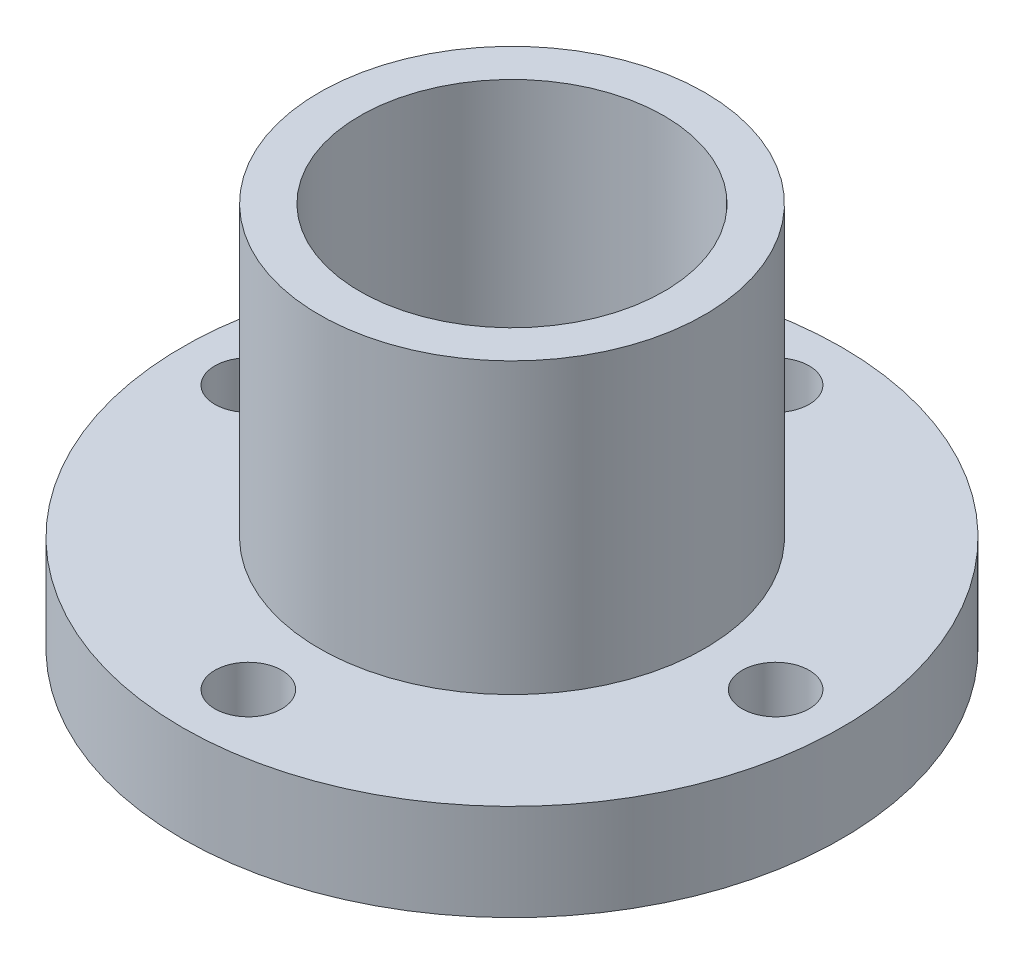
ISO-10303-21;
HEADER;
FILE_DESCRIPTION(('STEP AP214'),'2;1');
FILE_NAME('part.step','',(''),(''),'','','');
FILE_SCHEMA(('AUTOMOTIVE_DESIGN { 1 0 10303 214 1 1 1 1 }'));
ENDSEC;
DATA;
#1=APPLICATION_CONTEXT('core data for automotive mechanical design processes');
#2=APPLICATION_PROTOCOL_DEFINITION('international standard','automotive_design',2000,#1);
#3=PRODUCT_CONTEXT('',#1,'mechanical');
#4=PRODUCT('Part','Part','',(#3));
#5=PRODUCT_RELATED_PRODUCT_CATEGORY('part','',(#4));
#6=PRODUCT_DEFINITION_FORMATION('','',#4);
#7=PRODUCT_DEFINITION_CONTEXT('part definition',#1,'design');
#8=PRODUCT_DEFINITION('design','',#6,#7);
#9=PRODUCT_DEFINITION_SHAPE('','',#8);
#10=(LENGTH_UNIT() NAMED_UNIT(*) SI_UNIT(.MILLI.,.METRE.));
#11=(NAMED_UNIT(*) PLANE_ANGLE_UNIT() SI_UNIT($,.RADIAN.));
#12=(NAMED_UNIT(*) SI_UNIT($,.STERADIAN.) SOLID_ANGLE_UNIT());
#13=UNCERTAINTY_MEASURE_WITH_UNIT(LENGTH_MEASURE(1.E-05),#10,'distance_accuracy_value','');
#14=(GEOMETRIC_REPRESENTATION_CONTEXT(3) GLOBAL_UNCERTAINTY_ASSIGNED_CONTEXT((#13)) GLOBAL_UNIT_ASSIGNED_CONTEXT((#10,
#11,#12)) REPRESENTATION_CONTEXT('',''));
#15=CARTESIAN_POINT('',(0.,0.,0.));
#16=DIRECTION('',(0.,0.,1.));
#17=DIRECTION('',(1.,0.,0.));
#18=AXIS2_PLACEMENT_3D('',#15,#16,#17);
#19=CARTESIAN_POINT('',(15.,0.,0.));
#20=DIRECTION('',(0.,-1.,0.));
#21=DIRECTION('',(0.,0.,-1.));
#22=AXIS2_PLACEMENT_3D('',#19,#20,#21);
#23=PLANE('',#22);
#24=CARTESIAN_POINT('',(0.,0.,-26.));
#25=DIRECTION('',(0.,1.,0.));
#26=DIRECTION('',(0.,0.,1.));
#27=AXIS2_PLACEMENT_3D('',#24,#25,#26);
#28=CIRCLE('',#27,3.3);
#29=CARTESIAN_POINT('',(0.,0.,-22.7));
#30=VERTEX_POINT('',#29);
#31=EDGE_CURVE('E102',#30,#30,#28,.T.);
#32=ORIENTED_EDGE('',*,*,#31,.T.);
#33=EDGE_LOOP('',(#32));
#34=FACE_BOUND('',#33,.T.);
#35=CARTESIAN_POINT('',(0.,0.,26.));
#36=DIRECTION('',(0.,1.,0.));
#37=DIRECTION('',(0.,0.,1.));
#38=AXIS2_PLACEMENT_3D('',#35,#36,#37);
#39=CIRCLE('',#38,3.3);
#40=CARTESIAN_POINT('',(0.,0.,29.3));
#41=VERTEX_POINT('',#40);
#42=EDGE_CURVE('E94',#41,#41,#39,.T.);
#43=ORIENTED_EDGE('',*,*,#42,.T.);
#44=EDGE_LOOP('',(#43));
#45=FACE_BOUND('',#44,.T.);
#46=CARTESIAN_POINT('',(26.,0.,0.));
#47=DIRECTION('',(0.,1.,0.));
#48=DIRECTION('',(0.,0.,1.));
#49=AXIS2_PLACEMENT_3D('',#46,#47,#48);
#50=CIRCLE('',#49,3.3);
#51=CARTESIAN_POINT('',(26.,0.,3.29999999999999));
#52=VERTEX_POINT('',#51);
#53=EDGE_CURVE('E86',#52,#52,#50,.T.);
#54=ORIENTED_EDGE('',*,*,#53,.T.);
#55=EDGE_LOOP('',(#54));
#56=FACE_BOUND('',#55,.T.);
#57=CARTESIAN_POINT('',(0.,0.,0.));
#58=DIRECTION('',(0.,-1.,0.));
#59=DIRECTION('',(0.,0.,-1.));
#60=AXIS2_PLACEMENT_3D('',#57,#58,#59);
#61=CIRCLE('',#60,15.);
#62=CARTESIAN_POINT('',(0.,0.,-15.));
#63=VERTEX_POINT('',#62);
#64=EDGE_CURVE('E51',#63,#63,#61,.T.);
#65=ORIENTED_EDGE('',*,*,#64,.F.);
#66=EDGE_LOOP('',(#65));
#67=FACE_BOUND('',#66,.T.);
#68=CARTESIAN_POINT('',(0.,0.,0.));
#69=DIRECTION('',(0.,-1.,0.));
#70=DIRECTION('',(0.,0.,-1.));
#71=AXIS2_PLACEMENT_3D('',#68,#69,#70);
#72=CIRCLE('',#71,32.5);
#73=CARTESIAN_POINT('',(0.,0.,-32.5));
#74=VERTEX_POINT('',#73);
#75=EDGE_CURVE('E57',#74,#74,#72,.T.);
#76=ORIENTED_EDGE('',*,*,#75,.T.);
#77=EDGE_LOOP('',(#76));
#78=FACE_BOUND('',#77,.T.);
#79=CARTESIAN_POINT('',(-26.,0.,0.));
#80=DIRECTION('',(0.,1.,0.));
#81=DIRECTION('',(0.,0.,1.));
#82=AXIS2_PLACEMENT_3D('',#79,#80,#81);
#83=CIRCLE('',#82,3.3);
#84=CARTESIAN_POINT('',(-26.,0.,3.3));
#85=VERTEX_POINT('',#84);
#86=EDGE_CURVE('E78',#85,#85,#83,.T.);
#87=ORIENTED_EDGE('',*,*,#86,.T.);
#88=EDGE_LOOP('',(#87));
#89=FACE_BOUND('',#88,.T.);
#90=ADVANCED_FACE('F43',(#34,#45,#56,#67,#78,#89),#23,.T.);
#91=CARTESIAN_POINT('',(19.,38.,0.));
#92=DIRECTION('',(0.,1.,0.));
#93=DIRECTION('',(0.,0.,1.));
#94=AXIS2_PLACEMENT_3D('',#91,#92,#93);
#95=PLANE('',#94);
#96=CARTESIAN_POINT('',(0.,38.,0.));
#97=DIRECTION('',(0.,-1.,0.));
#98=DIRECTION('',(0.,0.,-1.));
#99=AXIS2_PLACEMENT_3D('',#96,#97,#98);
#100=CIRCLE('',#99,15.);
#101=CARTESIAN_POINT('',(0.,38.,-15.));
#102=VERTEX_POINT('',#101);
#103=EDGE_CURVE('E10',#102,#102,#100,.T.);
#104=ORIENTED_EDGE('',*,*,#103,.T.);
#105=EDGE_LOOP('',(#104));
#106=FACE_BOUND('',#105,.T.);
#107=CARTESIAN_POINT('',(0.,38.,0.));
#108=DIRECTION('',(0.,-1.,0.));
#109=DIRECTION('',(0.,0.,-1.));
#110=AXIS2_PLACEMENT_3D('',#107,#108,#109);
#111=CIRCLE('',#110,19.);
#112=CARTESIAN_POINT('',(0.,38.,-19.));
#113=VERTEX_POINT('',#112);
#114=EDGE_CURVE('E74',#113,#113,#111,.T.);
#115=ORIENTED_EDGE('',*,*,#114,.F.);
#116=EDGE_LOOP('',(#115));
#117=FACE_BOUND('',#116,.T.);
#118=ADVANCED_FACE('F45',(#106,#117),#95,.T.);
#119=CARTESIAN_POINT('',(0.,0.,0.));
#120=DIRECTION('',(0.,-1.,0.));
#121=DIRECTION('',(0.,0.,-1.));
#122=AXIS2_PLACEMENT_3D('',#119,#120,#121);
#123=CYLINDRICAL_SURFACE('',#122,15.);
#124=ORIENTED_EDGE('',*,*,#64,.T.);
#125=EDGE_LOOP('',(#124));
#126=FACE_BOUND('',#125,.T.);
#127=ORIENTED_EDGE('',*,*,#103,.F.);
#128=EDGE_LOOP('',(#127));
#129=FACE_BOUND('',#128,.T.);
#130=ADVANCED_FACE('F132',(#126,#129),#123,.F.);
#131=CARTESIAN_POINT('',(0.,0.,0.));
#132=DIRECTION('',(0.,-1.,0.));
#133=DIRECTION('',(0.,0.,-1.));
#134=AXIS2_PLACEMENT_3D('',#131,#132,#133);
#135=CYLINDRICAL_SURFACE('',#134,32.5);
#136=CARTESIAN_POINT('',(0.,9.5,0.));
#137=DIRECTION('',(0.,-1.,0.));
#138=DIRECTION('',(0.,0.,-1.));
#139=AXIS2_PLACEMENT_3D('',#136,#137,#138);
#140=CIRCLE('',#139,32.5);
#141=CARTESIAN_POINT('',(0.,9.5,-32.5));
#142=VERTEX_POINT('',#141);
#143=EDGE_CURVE('E64',#142,#142,#140,.T.);
#144=ORIENTED_EDGE('',*,*,#143,.T.);
#145=EDGE_LOOP('',(#144));
#146=FACE_BOUND('',#145,.T.);
#147=ORIENTED_EDGE('',*,*,#75,.F.);
#148=EDGE_LOOP('',(#147));
#149=FACE_BOUND('',#148,.T.);
#150=ADVANCED_FACE('F118',(#146,#149),#135,.T.);
#151=CARTESIAN_POINT('',(32.5,9.5,0.));
#152=DIRECTION('',(0.,1.,0.));
#153=DIRECTION('',(0.,0.,1.));
#154=AXIS2_PLACEMENT_3D('',#151,#152,#153);
#155=PLANE('',#154);
#156=CARTESIAN_POINT('',(0.,9.5,-26.));
#157=DIRECTION('',(0.,1.,0.));
#158=DIRECTION('',(0.,0.,1.));
#159=AXIS2_PLACEMENT_3D('',#156,#157,#158);
#160=CIRCLE('',#159,3.3);
#161=CARTESIAN_POINT('',(0.,9.5,-22.7));
#162=VERTEX_POINT('',#161);
#163=EDGE_CURVE('E106',#162,#162,#160,.T.);
#164=ORIENTED_EDGE('',*,*,#163,.F.);
#165=EDGE_LOOP('',(#164));
#166=FACE_BOUND('',#165,.T.);
#167=CARTESIAN_POINT('',(0.,9.5,26.));
#168=DIRECTION('',(0.,1.,0.));
#169=DIRECTION('',(0.,0.,1.));
#170=AXIS2_PLACEMENT_3D('',#167,#168,#169);
#171=CIRCLE('',#170,3.3);
#172=CARTESIAN_POINT('',(0.,9.5,29.3));
#173=VERTEX_POINT('',#172);
#174=EDGE_CURVE('E98',#173,#173,#171,.T.);
#175=ORIENTED_EDGE('',*,*,#174,.F.);
#176=EDGE_LOOP('',(#175));
#177=FACE_BOUND('',#176,.T.);
#178=CARTESIAN_POINT('',(26.,9.5,0.));
#179=DIRECTION('',(0.,1.,0.));
#180=DIRECTION('',(0.,0.,1.));
#181=AXIS2_PLACEMENT_3D('',#178,#179,#180);
#182=CIRCLE('',#181,3.3);
#183=CARTESIAN_POINT('',(26.,9.5,3.29999999999999));
#184=VERTEX_POINT('',#183);
#185=EDGE_CURVE('E90',#184,#184,#182,.T.);
#186=ORIENTED_EDGE('',*,*,#185,.F.);
#187=EDGE_LOOP('',(#186));
#188=FACE_BOUND('',#187,.T.);
#189=CARTESIAN_POINT('',(-26.,9.5,0.));
#190=DIRECTION('',(0.,1.,0.));
#191=DIRECTION('',(0.,0.,1.));
#192=AXIS2_PLACEMENT_3D('',#189,#190,#191);
#193=CIRCLE('',#192,3.3);
#194=CARTESIAN_POINT('',(-26.,9.5,3.3));
#195=VERTEX_POINT('',#194);
#196=EDGE_CURVE('E82',#195,#195,#193,.T.);
#197=ORIENTED_EDGE('',*,*,#196,.F.);
#198=EDGE_LOOP('',(#197));
#199=FACE_BOUND('',#198,.T.);
#200=CARTESIAN_POINT('',(0.,9.5,0.));
#201=DIRECTION('',(0.,-1.,0.));
#202=DIRECTION('',(0.,0.,-1.));
#203=AXIS2_PLACEMENT_3D('',#200,#201,#202);
#204=CIRCLE('',#203,19.);
#205=CARTESIAN_POINT('',(0.,9.5,-19.));
#206=VERTEX_POINT('',#205);
#207=EDGE_CURVE('E70',#206,#206,#204,.T.);
#208=ORIENTED_EDGE('',*,*,#207,.T.);
#209=EDGE_LOOP('',(#208));
#210=FACE_BOUND('',#209,.T.);
#211=ORIENTED_EDGE('',*,*,#143,.F.);
#212=EDGE_LOOP('',(#211));
#213=FACE_BOUND('',#212,.T.);
#214=ADVANCED_FACE('F114',(#166,#177,#188,#199,#210,#213),#155,.T.);
#215=CARTESIAN_POINT('',(0.,0.,0.));
#216=DIRECTION('',(0.,-1.,0.));
#217=DIRECTION('',(0.,0.,-1.));
#218=AXIS2_PLACEMENT_3D('',#215,#216,#217);
#219=CYLINDRICAL_SURFACE('',#218,19.);
#220=ORIENTED_EDGE('',*,*,#114,.T.);
#221=EDGE_LOOP('',(#220));
#222=FACE_BOUND('',#221,.T.);
#223=ORIENTED_EDGE('',*,*,#207,.F.);
#224=EDGE_LOOP('',(#223));
#225=FACE_BOUND('',#224,.T.);
#226=ADVANCED_FACE('F117',(#222,#225),#219,.T.);
#227=CARTESIAN_POINT('',(-26.,9.5,0.));
#228=DIRECTION('',(0.,1.,0.));
#229=DIRECTION('',(0.,0.,1.));
#230=AXIS2_PLACEMENT_3D('',#227,#228,#229);
#231=CYLINDRICAL_SURFACE('',#230,3.3);
#232=ORIENTED_EDGE('',*,*,#86,.F.);
#233=EDGE_LOOP('',(#232));
#234=FACE_BOUND('',#233,.T.);
#235=ORIENTED_EDGE('',*,*,#196,.T.);
#236=EDGE_LOOP('',(#235));
#237=FACE_BOUND('',#236,.T.);
#238=ADVANCED_FACE('F142',(#234,#237),#231,.F.);
#239=CARTESIAN_POINT('',(26.,9.5,0.));
#240=DIRECTION('',(0.,1.,0.));
#241=DIRECTION('',(0.,0.,1.));
#242=AXIS2_PLACEMENT_3D('',#239,#240,#241);
#243=CYLINDRICAL_SURFACE('',#242,3.3);
#244=ORIENTED_EDGE('',*,*,#53,.F.);
#245=EDGE_LOOP('',(#244));
#246=FACE_BOUND('',#245,.T.);
#247=ORIENTED_EDGE('',*,*,#185,.T.);
#248=EDGE_LOOP('',(#247));
#249=FACE_BOUND('',#248,.T.);
#250=ADVANCED_FACE('F145',(#246,#249),#243,.F.);
#251=CARTESIAN_POINT('',(0.,9.5,26.));
#252=DIRECTION('',(0.,1.,0.));
#253=DIRECTION('',(0.,0.,1.));
#254=AXIS2_PLACEMENT_3D('',#251,#252,#253);
#255=CYLINDRICAL_SURFACE('',#254,3.3);
#256=ORIENTED_EDGE('',*,*,#42,.F.);
#257=EDGE_LOOP('',(#256));
#258=FACE_BOUND('',#257,.T.);
#259=ORIENTED_EDGE('',*,*,#174,.T.);
#260=EDGE_LOOP('',(#259));
#261=FACE_BOUND('',#260,.T.);
#262=ADVANCED_FACE('F151',(#258,#261),#255,.F.);
#263=CARTESIAN_POINT('',(0.,9.5,-26.));
#264=DIRECTION('',(0.,1.,0.));
#265=DIRECTION('',(0.,0.,1.));
#266=AXIS2_PLACEMENT_3D('',#263,#264,#265);
#267=CYLINDRICAL_SURFACE('',#266,3.3);
#268=ORIENTED_EDGE('',*,*,#31,.F.);
#269=EDGE_LOOP('',(#268));
#270=FACE_BOUND('',#269,.T.);
#271=ORIENTED_EDGE('',*,*,#163,.T.);
#272=EDGE_LOOP('',(#271));
#273=FACE_BOUND('',#272,.T.);
#274=ADVANCED_FACE('F112',(#270,#273),#267,.F.);
#275=CLOSED_SHELL('',(#90,#118,#130,#150,#214,#226,#238,#250,#262,#274));
#276=MANIFOLD_SOLID_BREP('B2',#275);
#277=ADVANCED_BREP_SHAPE_REPRESENTATION('',(#18,#276),#14);
#278=SHAPE_DEFINITION_REPRESENTATION(#9,#277);
ENDSEC;
END-ISO-10303-21;
